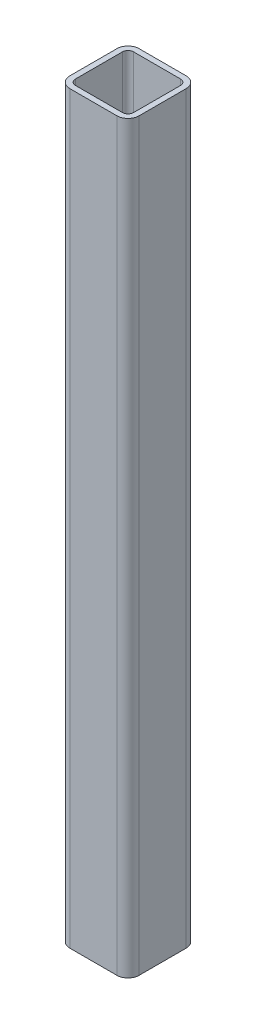
ISO-10303-21;
HEADER;
FILE_DESCRIPTION(('STEP AP214'),'2;1');
FILE_NAME('part.step','',(''),(''),'','','');
FILE_SCHEMA(('AUTOMOTIVE_DESIGN { 1 0 10303 214 1 1 1 1 }'));
ENDSEC;
DATA;
#1=APPLICATION_CONTEXT('core data for automotive mechanical design processes');
#2=APPLICATION_PROTOCOL_DEFINITION('international standard','automotive_design',2000,#1);
#3=PRODUCT_CONTEXT('',#1,'mechanical');
#4=PRODUCT('Part','Part','',(#3));
#5=PRODUCT_RELATED_PRODUCT_CATEGORY('part','',(#4));
#6=PRODUCT_DEFINITION_FORMATION('','',#4);
#7=PRODUCT_DEFINITION_CONTEXT('part definition',#1,'design');
#8=PRODUCT_DEFINITION('design','',#6,#7);
#9=PRODUCT_DEFINITION_SHAPE('','',#8);
#10=(LENGTH_UNIT() NAMED_UNIT(*) SI_UNIT(.MILLI.,.METRE.));
#11=(NAMED_UNIT(*) PLANE_ANGLE_UNIT() SI_UNIT($,.RADIAN.));
#12=(NAMED_UNIT(*) SI_UNIT($,.STERADIAN.) SOLID_ANGLE_UNIT());
#13=UNCERTAINTY_MEASURE_WITH_UNIT(LENGTH_MEASURE(1.E-05),#10,'distance_accuracy_value','');
#14=(GEOMETRIC_REPRESENTATION_CONTEXT(3) GLOBAL_UNCERTAINTY_ASSIGNED_CONTEXT((#13)) GLOBAL_UNIT_ASSIGNED_CONTEXT((#10,
#11,#12)) REPRESENTATION_CONTEXT('',''));
#15=CARTESIAN_POINT('',(0.,0.,0.));
#16=DIRECTION('',(0.,0.,1.));
#17=DIRECTION('',(1.,0.,0.));
#18=AXIS2_PLACEMENT_3D('',#15,#16,#17);
#19=CARTESIAN_POINT('',(-1206.,-1167.,89.9999999999999));
#20=DIRECTION('',(-1.,0.,0.));
#21=DIRECTION('',(0.,0.,1.));
#22=AXIS2_PLACEMENT_3D('',#19,#20,#21);
#23=CYLINDRICAL_SURFACE('',#22,2.49999999999995);
#24=CARTESIAN_POINT('',(-1200.,-1167.,89.9999999999999));
#25=DIRECTION('',(-1.,0.,0.));
#26=DIRECTION('',(0.,0.,1.));
#27=AXIS2_PLACEMENT_3D('',#24,#25,#26);
#28=CIRCLE('',#27,2.49999999999995);
#29=CARTESIAN_POINT('',(-1200.,-1167.,92.4999999999999));
#30=VERTEX_POINT('',#29);
#31=EDGE_CURVE('E22',#30,#30,#28,.T.);
#32=ORIENTED_EDGE('',*,*,#31,.T.);
#33=EDGE_LOOP('',(#32));
#34=FACE_BOUND('',#33,.T.);
#35=CARTESIAN_POINT('',(-1196.8,-1167.,89.9999999999999));
#36=DIRECTION('',(-1.,0.,0.));
#37=DIRECTION('',(0.,0.,1.));
#38=AXIS2_PLACEMENT_3D('',#35,#36,#37);
#39=CIRCLE('',#38,2.49999999999995);
#40=CARTESIAN_POINT('',(-1196.8,-1167.,92.4999999999999));
#41=VERTEX_POINT('',#40);
#42=EDGE_CURVE('E171',#41,#41,#39,.T.);
#43=ORIENTED_EDGE('',*,*,#42,.F.);
#44=EDGE_LOOP('',(#43));
#45=FACE_BOUND('',#44,.T.);
#46=ADVANCED_FACE('F19',(#34,#45),#23,.F.);
#47=CARTESIAN_POINT('',(-1206.,-1047.,89.9999999999999));
#48=DIRECTION('',(-1.,0.,0.));
#49=DIRECTION('',(0.,0.,1.));
#50=AXIS2_PLACEMENT_3D('',#47,#48,#49);
#51=CYLINDRICAL_SURFACE('',#50,2.49999999999995);
#52=CARTESIAN_POINT('',(-1200.,-1047.,89.9999999999999));
#53=DIRECTION('',(-1.,0.,0.));
#54=DIRECTION('',(0.,0.,1.));
#55=AXIS2_PLACEMENT_3D('',#52,#53,#54);
#56=CIRCLE('',#55,2.49999999999995);
#57=CARTESIAN_POINT('',(-1200.,-1047.,92.4999999999999));
#58=VERTEX_POINT('',#57);
#59=EDGE_CURVE('E175',#58,#58,#56,.T.);
#60=ORIENTED_EDGE('',*,*,#59,.T.);
#61=EDGE_LOOP('',(#60));
#62=FACE_BOUND('',#61,.T.);
#63=CARTESIAN_POINT('',(-1196.8,-1047.,89.9999999999999));
#64=DIRECTION('',(-1.,0.,0.));
#65=DIRECTION('',(0.,0.,1.));
#66=AXIS2_PLACEMENT_3D('',#63,#64,#65);
#67=CIRCLE('',#66,2.49999999999995);
#68=CARTESIAN_POINT('',(-1196.8,-1047.,92.4999999999999));
#69=VERTEX_POINT('',#68);
#70=EDGE_CURVE('E534',#69,#69,#67,.T.);
#71=ORIENTED_EDGE('',*,*,#70,.F.);
#72=EDGE_LOOP('',(#71));
#73=FACE_BOUND('',#72,.T.);
#74=ADVANCED_FACE('F509',(#62,#73),#51,.F.);
#75=CARTESIAN_POINT('',(-1206.,-927.,89.9999999999999));
#76=DIRECTION('',(-1.,0.,0.));
#77=DIRECTION('',(0.,0.,1.));
#78=AXIS2_PLACEMENT_3D('',#75,#76,#77);
#79=CYLINDRICAL_SURFACE('',#78,2.49999999999995);
#80=CARTESIAN_POINT('',(-1200.,-927.,89.9999999999999));
#81=DIRECTION('',(-1.,0.,0.));
#82=DIRECTION('',(0.,0.,1.));
#83=AXIS2_PLACEMENT_3D('',#80,#81,#82);
#84=CIRCLE('',#83,2.49999999999995);
#85=CARTESIAN_POINT('',(-1200.,-927.,92.4999999999999));
#86=VERTEX_POINT('',#85);
#87=EDGE_CURVE('E172',#86,#86,#84,.T.);
#88=ORIENTED_EDGE('',*,*,#87,.T.);
#89=EDGE_LOOP('',(#88));
#90=FACE_BOUND('',#89,.T.);
#91=CARTESIAN_POINT('',(-1196.8,-927.,89.9999999999999));
#92=DIRECTION('',(-1.,0.,0.));
#93=DIRECTION('',(0.,0.,1.));
#94=AXIS2_PLACEMENT_3D('',#91,#92,#93);
#95=CIRCLE('',#94,2.49999999999995);
#96=CARTESIAN_POINT('',(-1196.8,-927.,92.4999999999999));
#97=VERTEX_POINT('',#96);
#98=EDGE_CURVE('E157',#97,#97,#95,.T.);
#99=ORIENTED_EDGE('',*,*,#98,.F.);
#100=EDGE_LOOP('',(#99));
#101=FACE_BOUND('',#100,.T.);
#102=ADVANCED_FACE('F499',(#90,#101),#79,.F.);
#103=CARTESIAN_POINT('',(-1206.,-807.,89.9999999999999));
#104=DIRECTION('',(-1.,0.,0.));
#105=DIRECTION('',(0.,0.,1.));
#106=AXIS2_PLACEMENT_3D('',#103,#104,#105);
#107=CYLINDRICAL_SURFACE('',#106,2.49999999999995);
#108=CARTESIAN_POINT('',(-1200.,-807.,89.9999999999999));
#109=DIRECTION('',(-1.,0.,0.));
#110=DIRECTION('',(0.,0.,1.));
#111=AXIS2_PLACEMENT_3D('',#108,#109,#110);
#112=CIRCLE('',#111,2.49999999999995);
#113=CARTESIAN_POINT('',(-1200.,-807.,92.4999999999999));
#114=VERTEX_POINT('',#113);
#115=EDGE_CURVE('E166',#114,#114,#112,.T.);
#116=ORIENTED_EDGE('',*,*,#115,.T.);
#117=EDGE_LOOP('',(#116));
#118=FACE_BOUND('',#117,.T.);
#119=CARTESIAN_POINT('',(-1196.8,-807.,89.9999999999999));
#120=DIRECTION('',(-1.,0.,0.));
#121=DIRECTION('',(0.,0.,1.));
#122=AXIS2_PLACEMENT_3D('',#119,#120,#121);
#123=CIRCLE('',#122,2.49999999999995);
#124=CARTESIAN_POINT('',(-1196.8,-807.,92.4999999999999));
#125=VERTEX_POINT('',#124);
#126=EDGE_CURVE('E152',#125,#125,#123,.T.);
#127=ORIENTED_EDGE('',*,*,#126,.F.);
#128=EDGE_LOOP('',(#127));
#129=FACE_BOUND('',#128,.T.);
#130=ADVANCED_FACE('F490',(#118,#129),#107,.F.);
#131=CARTESIAN_POINT('',(-1193.6,-1220.,76.3999999999998));
#132=DIRECTION('',(0.,1.,0.));
#133=DIRECTION('',(0.,0.,1.));
#134=AXIS2_PLACEMENT_3D('',#131,#132,#133);
#135=CYLINDRICAL_SURFACE('',#134,6.39999999999996);
#136=CARTESIAN_POINT('',(-1193.6,-1200.,76.3999999999998));
#137=DIRECTION('',(0.,1.,0.));
#138=DIRECTION('',(0.,0.,1.));
#139=AXIS2_PLACEMENT_3D('',#136,#137,#138);
#140=CIRCLE('',#139,6.39999999999996);
#141=CARTESIAN_POINT('',(-1200.,-1200.,76.3999999999998));
#142=VERTEX_POINT('',#141);
#143=CARTESIAN_POINT('',(-1193.6,-1200.,69.9999999999998));
#144=VERTEX_POINT('',#143);
#145=EDGE_CURVE('E241',#142,#144,#140,.F.);
#146=ORIENTED_EDGE('',*,*,#145,.F.);
#147=DIRECTION('',(0.,1.,0.));
#148=VECTOR('',#147,1.);
#149=CARTESIAN_POINT('',(-1200.,-1220.,76.3999999999998));
#150=LINE('',#149,#148);
#151=CARTESIAN_POINT('',(-1200.,-770.,76.3999999999998));
#152=VERTEX_POINT('',#151);
#153=EDGE_CURVE('E128',#142,#152,#150,.T.);
#154=ORIENTED_EDGE('',*,*,#153,.T.);
#155=CARTESIAN_POINT('',(-1193.6,-770.,76.3999999999998));
#156=DIRECTION('',(0.,1.,0.));
#157=DIRECTION('',(0.,0.,1.));
#158=AXIS2_PLACEMENT_3D('',#155,#156,#157);
#159=CIRCLE('',#158,6.39999999999996);
#160=CARTESIAN_POINT('',(-1193.6,-770.,69.9999999999998));
#161=VERTEX_POINT('',#160);
#162=EDGE_CURVE('E214',#161,#152,#159,.T.);
#163=ORIENTED_EDGE('',*,*,#162,.F.);
#164=DIRECTION('',(0.,1.,0.));
#165=VECTOR('',#164,1.);
#166=CARTESIAN_POINT('',(-1193.6,-1220.,69.9999999999998));
#167=LINE('',#166,#165);
#168=EDGE_CURVE('E195',#161,#144,#167,.F.);
#169=ORIENTED_EDGE('',*,*,#168,.T.);
#170=EDGE_LOOP('',(#146,#154,#163,#169));
#171=FACE_BOUND('',#170,.T.);
#172=ADVANCED_FACE('F239',(#171),#135,.T.);
#173=CARTESIAN_POINT('',(-1193.6,-1220.,69.9999999999998));
#174=DIRECTION('',(0.,0.,1.));
#175=DIRECTION('',(1.,0.,0.));
#176=AXIS2_PLACEMENT_3D('',#173,#174,#175);
#177=PLANE('',#176);
#178=DIRECTION('',(1.,0.,0.));
#179=VECTOR('',#178,1.);
#180=CARTESIAN_POINT('',(-1166.4,-770.,69.9999999999998));
#181=LINE('',#180,#179);
#182=CARTESIAN_POINT('',(-1166.4,-770.,69.9999999999998));
#183=VERTEX_POINT('',#182);
#184=EDGE_CURVE('E215',#183,#161,#181,.F.);
#185=ORIENTED_EDGE('',*,*,#184,.F.);
#186=DIRECTION('',(0.,1.,0.));
#187=VECTOR('',#186,1.);
#188=CARTESIAN_POINT('',(-1166.4,-1220.,69.9999999999998));
#189=LINE('',#188,#187);
#190=CARTESIAN_POINT('',(-1166.4,-1200.,69.9999999999998));
#191=VERTEX_POINT('',#190);
#192=EDGE_CURVE('E192',#191,#183,#189,.T.);
#193=ORIENTED_EDGE('',*,*,#192,.F.);
#194=DIRECTION('',(1.,0.,0.));
#195=VECTOR('',#194,1.);
#196=CARTESIAN_POINT('',(-1193.6,-1200.,69.9999999999998));
#197=LINE('',#196,#195);
#198=EDGE_CURVE('E262',#144,#191,#197,.T.);
#199=ORIENTED_EDGE('',*,*,#198,.F.);
#200=ORIENTED_EDGE('',*,*,#168,.F.);
#201=EDGE_LOOP('',(#185,#193,#199,#200));
#202=FACE_BOUND('',#201,.T.);
#203=ADVANCED_FACE('F261',(#202),#177,.F.);
#204=CARTESIAN_POINT('',(-1166.4,-1220.,76.3999999999998));
#205=DIRECTION('',(0.,1.,0.));
#206=DIRECTION('',(0.,0.,1.));
#207=AXIS2_PLACEMENT_3D('',#204,#205,#206);
#208=CYLINDRICAL_SURFACE('',#207,6.39999999999996);
#209=CARTESIAN_POINT('',(-1166.4,-1200.,76.3999999999998));
#210=DIRECTION('',(0.,1.,0.));
#211=DIRECTION('',(0.,0.,1.));
#212=AXIS2_PLACEMENT_3D('',#209,#210,#211);
#213=CIRCLE('',#212,6.39999999999996);
#214=CARTESIAN_POINT('',(-1160.,-1200.,76.3999999999998));
#215=VERTEX_POINT('',#214);
#216=EDGE_CURVE('E257',#191,#215,#213,.F.);
#217=ORIENTED_EDGE('',*,*,#216,.F.);
#218=ORIENTED_EDGE('',*,*,#192,.T.);
#219=CARTESIAN_POINT('',(-1166.4,-770.,76.3999999999998));
#220=DIRECTION('',(0.,1.,0.));
#221=DIRECTION('',(0.,0.,1.));
#222=AXIS2_PLACEMENT_3D('',#219,#220,#221);
#223=CIRCLE('',#222,6.39999999999996);
#224=CARTESIAN_POINT('',(-1160.,-770.,76.3999999999998));
#225=VERTEX_POINT('',#224);
#226=EDGE_CURVE('E218',#225,#183,#223,.T.);
#227=ORIENTED_EDGE('',*,*,#226,.F.);
#228=DIRECTION('',(0.,1.,0.));
#229=VECTOR('',#228,1.);
#230=CARTESIAN_POINT('',(-1160.,-1220.,76.3999999999999));
#231=LINE('',#230,#229);
#232=EDGE_CURVE('E190',#225,#215,#231,.F.);
#233=ORIENTED_EDGE('',*,*,#232,.T.);
#234=EDGE_LOOP('',(#217,#218,#227,#233));
#235=FACE_BOUND('',#234,.T.);
#236=ADVANCED_FACE('F254',(#235),#208,.T.);
#237=CARTESIAN_POINT('',(-1160.,-1220.,103.6));
#238=DIRECTION('',(-1.,0.,0.));
#239=DIRECTION('',(0.,0.,1.));
#240=AXIS2_PLACEMENT_3D('',#237,#238,#239);
#241=PLANE('',#240);
#242=DIRECTION('',(0.,0.,1.));
#243=VECTOR('',#242,1.);
#244=CARTESIAN_POINT('',(-1160.,-770.,-880.));
#245=LINE('',#244,#243);
#246=CARTESIAN_POINT('',(-1160.,-770.,103.6));
#247=VERTEX_POINT('',#246);
#248=EDGE_CURVE('E219',#247,#225,#245,.F.);
#249=ORIENTED_EDGE('',*,*,#248,.F.);
#250=DIRECTION('',(0.,1.,0.));
#251=VECTOR('',#250,1.);
#252=CARTESIAN_POINT('',(-1160.,-1220.,103.6));
#253=LINE('',#252,#251);
#254=CARTESIAN_POINT('',(-1160.,-1200.,103.6));
#255=VERTEX_POINT('',#254);
#256=EDGE_CURVE('E187',#255,#247,#253,.T.);
#257=ORIENTED_EDGE('',*,*,#256,.F.);
#258=DIRECTION('',(0.,0.,-1.));
#259=VECTOR('',#258,1.);
#260=CARTESIAN_POINT('',(-1160.,-1200.,-880.));
#261=LINE('',#260,#259);
#262=EDGE_CURVE('E326',#215,#255,#261,.F.);
#263=ORIENTED_EDGE('',*,*,#262,.F.);
#264=ORIENTED_EDGE('',*,*,#232,.F.);
#265=EDGE_LOOP('',(#249,#257,#263,#264));
#266=FACE_BOUND('',#265,.T.);
#267=ADVANCED_FACE('F348',(#266),#241,.F.);
#268=CARTESIAN_POINT('',(-1166.4,-1220.,103.6));
#269=DIRECTION('',(0.,1.,0.));
#270=DIRECTION('',(0.,0.,1.));
#271=AXIS2_PLACEMENT_3D('',#268,#269,#270);
#272=CYLINDRICAL_SURFACE('',#271,6.39999999999996);
#273=CARTESIAN_POINT('',(-1166.4,-1200.,103.6));
#274=DIRECTION('',(0.,1.,0.));
#275=DIRECTION('',(0.,0.,1.));
#276=AXIS2_PLACEMENT_3D('',#273,#274,#275);
#277=CIRCLE('',#276,6.39999999999996);
#278=CARTESIAN_POINT('',(-1166.4,-1200.,110.));
#279=VERTEX_POINT('',#278);
#280=EDGE_CURVE('E329',#255,#279,#277,.F.);
#281=ORIENTED_EDGE('',*,*,#280,.F.);
#282=ORIENTED_EDGE('',*,*,#256,.T.);
#283=CARTESIAN_POINT('',(-1166.4,-770.,103.6));
#284=DIRECTION('',(0.,1.,0.));
#285=DIRECTION('',(0.,0.,1.));
#286=AXIS2_PLACEMENT_3D('',#283,#284,#285);
#287=CIRCLE('',#286,6.39999999999996);
#288=CARTESIAN_POINT('',(-1166.4,-770.,110.));
#289=VERTEX_POINT('',#288);
#290=EDGE_CURVE('E137',#289,#247,#287,.T.);
#291=ORIENTED_EDGE('',*,*,#290,.F.);
#292=DIRECTION('',(0.,1.,0.));
#293=VECTOR('',#292,1.);
#294=CARTESIAN_POINT('',(-1166.4,-1220.,110.));
#295=LINE('',#294,#293);
#296=EDGE_CURVE('E129',#289,#279,#295,.F.);
#297=ORIENTED_EDGE('',*,*,#296,.T.);
#298=EDGE_LOOP('',(#281,#282,#291,#297));
#299=FACE_BOUND('',#298,.T.);
#300=ADVANCED_FACE('F346',(#299),#272,.T.);
#301=CARTESIAN_POINT('',(-1166.4,-1220.,110.));
#302=DIRECTION('',(0.,0.,-1.));
#303=DIRECTION('',(-1.,0.,0.));
#304=AXIS2_PLACEMENT_3D('',#301,#302,#303);
#305=PLANE('',#304);
#306=DIRECTION('',(1.,0.,0.));
#307=VECTOR('',#306,1.);
#308=CARTESIAN_POINT('',(-1166.4,-770.,110.));
#309=LINE('',#308,#307);
#310=CARTESIAN_POINT('',(-1193.6,-770.,110.));
#311=VERTEX_POINT('',#310);
#312=EDGE_CURVE('E132',#311,#289,#309,.T.);
#313=ORIENTED_EDGE('',*,*,#312,.F.);
#314=DIRECTION('',(0.,1.,0.));
#315=VECTOR('',#314,1.);
#316=CARTESIAN_POINT('',(-1193.6,-1220.,110.));
#317=LINE('',#316,#315);
#318=CARTESIAN_POINT('',(-1193.6,-1200.,110.));
#319=VERTEX_POINT('',#318);
#320=EDGE_CURVE('E120',#319,#311,#317,.T.);
#321=ORIENTED_EDGE('',*,*,#320,.F.);
#322=DIRECTION('',(1.,0.,0.));
#323=VECTOR('',#322,1.);
#324=CARTESIAN_POINT('',(-1193.6,-1200.,110.));
#325=LINE('',#324,#323);
#326=EDGE_CURVE('E330',#279,#319,#325,.F.);
#327=ORIENTED_EDGE('',*,*,#326,.F.);
#328=ORIENTED_EDGE('',*,*,#296,.F.);
#329=EDGE_LOOP('',(#313,#321,#327,#328));
#330=FACE_BOUND('',#329,.T.);
#331=ADVANCED_FACE('F133',(#330),#305,.F.);
#332=CARTESIAN_POINT('',(-1193.6,-1220.,103.6));
#333=DIRECTION('',(0.,1.,0.));
#334=DIRECTION('',(0.,0.,1.));
#335=AXIS2_PLACEMENT_3D('',#332,#333,#334);
#336=CYLINDRICAL_SURFACE('',#335,6.40000000000002);
#337=CARTESIAN_POINT('',(-1193.6,-1200.,103.6));
#338=DIRECTION('',(0.,1.,0.));
#339=DIRECTION('',(0.,0.,1.));
#340=AXIS2_PLACEMENT_3D('',#337,#338,#339);
#341=CIRCLE('',#340,6.40000000000002);
#342=CARTESIAN_POINT('',(-1200.,-1200.,103.6));
#343=VERTEX_POINT('',#342);
#344=EDGE_CURVE('E124',#319,#343,#341,.F.);
#345=ORIENTED_EDGE('',*,*,#344,.F.);
#346=ORIENTED_EDGE('',*,*,#320,.T.);
#347=CARTESIAN_POINT('',(-1193.6,-770.,103.6));
#348=DIRECTION('',(0.,1.,0.));
#349=DIRECTION('',(0.,0.,1.));
#350=AXIS2_PLACEMENT_3D('',#347,#348,#349);
#351=CIRCLE('',#350,6.40000000000002);
#352=CARTESIAN_POINT('',(-1200.,-770.,103.6));
#353=VERTEX_POINT('',#352);
#354=EDGE_CURVE('E117',#353,#311,#351,.T.);
#355=ORIENTED_EDGE('',*,*,#354,.F.);
#356=DIRECTION('',(0.,1.,0.));
#357=VECTOR('',#356,1.);
#358=CARTESIAN_POINT('',(-1200.,-1220.,103.6));
#359=LINE('',#358,#357);
#360=EDGE_CURVE('E233',#353,#343,#359,.F.);
#361=ORIENTED_EDGE('',*,*,#360,.T.);
#362=EDGE_LOOP('',(#345,#346,#355,#361));
#363=FACE_BOUND('',#362,.T.);
#364=ADVANCED_FACE('F122',(#363),#336,.T.);
#365=CARTESIAN_POINT('',(-1200.,-1220.,76.3999999999998));
#366=DIRECTION('',(1.,0.,0.));
#367=DIRECTION('',(0.,0.,-1.));
#368=AXIS2_PLACEMENT_3D('',#365,#366,#367);
#369=PLANE('',#368);
#370=ORIENTED_EDGE('',*,*,#115,.F.);
#371=EDGE_LOOP('',(#370));
#372=FACE_BOUND('',#371,.T.);
#373=ORIENTED_EDGE('',*,*,#87,.F.);
#374=EDGE_LOOP('',(#373));
#375=FACE_BOUND('',#374,.T.);
#376=ORIENTED_EDGE('',*,*,#59,.F.);
#377=EDGE_LOOP('',(#376));
#378=FACE_BOUND('',#377,.T.);
#379=ORIENTED_EDGE('',*,*,#31,.F.);
#380=EDGE_LOOP('',(#379));
#381=FACE_BOUND('',#380,.T.);
#382=DIRECTION('',(0.,0.,1.));
#383=VECTOR('',#382,1.);
#384=CARTESIAN_POINT('',(-1200.,-770.,-880.));
#385=LINE('',#384,#383);
#386=EDGE_CURVE('E143',#152,#353,#385,.T.);
#387=ORIENTED_EDGE('',*,*,#386,.F.);
#388=ORIENTED_EDGE('',*,*,#153,.F.);
#389=DIRECTION('',(0.,0.,-1.));
#390=VECTOR('',#389,1.);
#391=CARTESIAN_POINT('',(-1200.,-1200.,-880.));
#392=LINE('',#391,#390);
#393=EDGE_CURVE('E266',#343,#142,#392,.T.);
#394=ORIENTED_EDGE('',*,*,#393,.F.);
#395=ORIENTED_EDGE('',*,*,#360,.F.);
#396=EDGE_LOOP('',(#387,#388,#394,#395));
#397=FACE_BOUND('',#396,.T.);
#398=ADVANCED_FACE('F244',(#372,#375,#378,#381,#397),#369,.F.);
#399=CARTESIAN_POINT('',(-1196.8,-1220.,76.3999999999998));
#400=DIRECTION('',(1.,0.,0.));
#401=DIRECTION('',(0.,0.,-1.));
#402=AXIS2_PLACEMENT_3D('',#399,#400,#401);
#403=PLANE('',#402);
#404=ORIENTED_EDGE('',*,*,#126,.T.);
#405=EDGE_LOOP('',(#404));
#406=FACE_BOUND('',#405,.T.);
#407=ORIENTED_EDGE('',*,*,#98,.T.);
#408=EDGE_LOOP('',(#407));
#409=FACE_BOUND('',#408,.T.);
#410=ORIENTED_EDGE('',*,*,#70,.T.);
#411=EDGE_LOOP('',(#410));
#412=FACE_BOUND('',#411,.T.);
#413=ORIENTED_EDGE('',*,*,#42,.T.);
#414=EDGE_LOOP('',(#413));
#415=FACE_BOUND('',#414,.T.);
#416=DIRECTION('',(0.,1.,0.));
#417=VECTOR('',#416,1.);
#418=CARTESIAN_POINT('',(-1196.8,-1220.,103.6));
#419=LINE('',#418,#417);
#420=CARTESIAN_POINT('',(-1196.8,-770.,103.6));
#421=VERTEX_POINT('',#420);
#422=CARTESIAN_POINT('',(-1196.8,-1200.,103.6));
#423=VERTEX_POINT('',#422);
#424=EDGE_CURVE('E156',#421,#423,#419,.F.);
#425=ORIENTED_EDGE('',*,*,#424,.T.);
#426=DIRECTION('',(0.,0.,-1.));
#427=VECTOR('',#426,1.);
#428=CARTESIAN_POINT('',(-1196.8,-1200.,-880.));
#429=LINE('',#428,#427);
#430=CARTESIAN_POINT('',(-1196.8,-1200.,76.3999999999998));
#431=VERTEX_POINT('',#430);
#432=EDGE_CURVE('E333',#431,#423,#429,.F.);
#433=ORIENTED_EDGE('',*,*,#432,.F.);
#434=DIRECTION('',(0.,1.,0.));
#435=VECTOR('',#434,1.);
#436=CARTESIAN_POINT('',(-1196.8,-1220.,76.3999999999998));
#437=LINE('',#436,#435);
#438=CARTESIAN_POINT('',(-1196.8,-770.,76.3999999999998));
#439=VERTEX_POINT('',#438);
#440=EDGE_CURVE('E231',#431,#439,#437,.T.);
#441=ORIENTED_EDGE('',*,*,#440,.T.);
#442=DIRECTION('',(0.,0.,1.));
#443=VECTOR('',#442,1.);
#444=CARTESIAN_POINT('',(-1196.8,-770.,-880.));
#445=LINE('',#444,#443);
#446=EDGE_CURVE('E206',#421,#439,#445,.F.);
#447=ORIENTED_EDGE('',*,*,#446,.F.);
#448=EDGE_LOOP('',(#425,#433,#441,#447));
#449=FACE_BOUND('',#448,.T.);
#450=ADVANCED_FACE('F318',(#406,#409,#412,#415,#449),#403,.T.);
#451=CARTESIAN_POINT('',(-1193.6,-1220.,103.6));
#452=DIRECTION('',(0.,1.,0.));
#453=DIRECTION('',(0.,0.,1.));
#454=AXIS2_PLACEMENT_3D('',#451,#452,#453);
#455=CYLINDRICAL_SURFACE('',#454,3.19999999999998);
#456=ORIENTED_EDGE('',*,*,#424,.F.);
#457=CARTESIAN_POINT('',(-1193.6,-770.,103.6));
#458=DIRECTION('',(0.,1.,0.));
#459=DIRECTION('',(0.,0.,1.));
#460=AXIS2_PLACEMENT_3D('',#457,#458,#459);
#461=CIRCLE('',#460,3.19999999999998);
#462=CARTESIAN_POINT('',(-1193.6,-770.,106.8));
#463=VERTEX_POINT('',#462);
#464=EDGE_CURVE('E209',#463,#421,#461,.F.);
#465=ORIENTED_EDGE('',*,*,#464,.F.);
#466=DIRECTION('',(0.,1.,0.));
#467=VECTOR('',#466,1.);
#468=CARTESIAN_POINT('',(-1193.6,-1220.,106.8));
#469=LINE('',#468,#467);
#470=CARTESIAN_POINT('',(-1193.6,-1200.,106.8));
#471=VERTEX_POINT('',#470);
#472=EDGE_CURVE('E227',#471,#463,#469,.T.);
#473=ORIENTED_EDGE('',*,*,#472,.F.);
#474=CARTESIAN_POINT('',(-1193.6,-1200.,103.6));
#475=DIRECTION('',(0.,1.,0.));
#476=DIRECTION('',(0.,0.,1.));
#477=AXIS2_PLACEMENT_3D('',#474,#475,#476);
#478=CIRCLE('',#477,3.19999999999998);
#479=EDGE_CURVE('E314',#423,#471,#478,.T.);
#480=ORIENTED_EDGE('',*,*,#479,.F.);
#481=EDGE_LOOP('',(#456,#465,#473,#480));
#482=FACE_BOUND('',#481,.T.);
#483=ADVANCED_FACE('F312',(#482),#455,.F.);
#484=CARTESIAN_POINT('',(-1166.4,-1220.,106.8));
#485=DIRECTION('',(0.,0.,-1.));
#486=DIRECTION('',(-1.,0.,0.));
#487=AXIS2_PLACEMENT_3D('',#484,#485,#486);
#488=PLANE('',#487);
#489=DIRECTION('',(0.,1.,0.));
#490=VECTOR('',#489,1.);
#491=CARTESIAN_POINT('',(-1166.4,-1220.,106.8));
#492=LINE('',#491,#490);
#493=CARTESIAN_POINT('',(-1166.4,-770.,106.8));
#494=VERTEX_POINT('',#493);
#495=CARTESIAN_POINT('',(-1166.4,-1200.,106.8));
#496=VERTEX_POINT('',#495);
#497=EDGE_CURVE('E224',#494,#496,#492,.F.);
#498=ORIENTED_EDGE('',*,*,#497,.T.);
#499=DIRECTION('',(1.,0.,0.));
#500=VECTOR('',#499,1.);
#501=CARTESIAN_POINT('',(-1193.6,-1200.,106.8));
#502=LINE('',#501,#500);
#503=EDGE_CURVE('E308',#471,#496,#502,.T.);
#504=ORIENTED_EDGE('',*,*,#503,.F.);
#505=ORIENTED_EDGE('',*,*,#472,.T.);
#506=DIRECTION('',(1.,0.,0.));
#507=VECTOR('',#506,1.);
#508=CARTESIAN_POINT('',(-1166.4,-770.,106.8));
#509=LINE('',#508,#507);
#510=EDGE_CURVE('E210',#494,#463,#509,.F.);
#511=ORIENTED_EDGE('',*,*,#510,.F.);
#512=EDGE_LOOP('',(#498,#504,#505,#511));
#513=FACE_BOUND('',#512,.T.);
#514=ADVANCED_FACE('F303',(#513),#488,.T.);
#515=CARTESIAN_POINT('',(-1166.4,-1220.,103.6));
#516=DIRECTION('',(0.,1.,0.));
#517=DIRECTION('',(0.,0.,1.));
#518=AXIS2_PLACEMENT_3D('',#515,#516,#517);
#519=CYLINDRICAL_SURFACE('',#518,3.19999999999993);
#520=ORIENTED_EDGE('',*,*,#497,.F.);
#521=CARTESIAN_POINT('',(-1166.4,-770.,103.6));
#522=DIRECTION('',(0.,1.,0.));
#523=DIRECTION('',(0.,0.,1.));
#524=AXIS2_PLACEMENT_3D('',#521,#522,#523);
#525=CIRCLE('',#524,3.19999999999993);
#526=CARTESIAN_POINT('',(-1163.2,-770.,103.6));
#527=VERTEX_POINT('',#526);
#528=EDGE_CURVE('E202',#527,#494,#525,.F.);
#529=ORIENTED_EDGE('',*,*,#528,.F.);
#530=DIRECTION('',(0.,1.,0.));
#531=VECTOR('',#530,1.);
#532=CARTESIAN_POINT('',(-1163.2,-1220.,103.6));
#533=LINE('',#532,#531);
#534=CARTESIAN_POINT('',(-1163.2,-1200.,103.6));
#535=VERTEX_POINT('',#534);
#536=EDGE_CURVE('E147',#535,#527,#533,.T.);
#537=ORIENTED_EDGE('',*,*,#536,.F.);
#538=CARTESIAN_POINT('',(-1166.4,-1200.,103.6));
#539=DIRECTION('',(0.,1.,0.));
#540=DIRECTION('',(0.,0.,1.));
#541=AXIS2_PLACEMENT_3D('',#538,#539,#540);
#542=CIRCLE('',#541,3.19999999999993);
#543=EDGE_CURVE('E336',#496,#535,#542,.T.);
#544=ORIENTED_EDGE('',*,*,#543,.F.);
#545=EDGE_LOOP('',(#520,#529,#537,#544));
#546=FACE_BOUND('',#545,.T.);
#547=ADVANCED_FACE('F299',(#546),#519,.F.);
#548=CARTESIAN_POINT('',(-1163.2,-1220.,103.6));
#549=DIRECTION('',(-1.,0.,0.));
#550=DIRECTION('',(0.,0.,1.));
#551=AXIS2_PLACEMENT_3D('',#548,#549,#550);
#552=PLANE('',#551);
#553=DIRECTION('',(0.,1.,0.));
#554=VECTOR('',#553,1.);
#555=CARTESIAN_POINT('',(-1163.2,-1220.,76.3999999999998));
#556=LINE('',#555,#554);
#557=CARTESIAN_POINT('',(-1163.2,-770.,76.3999999999998));
#558=VERTEX_POINT('',#557);
#559=CARTESIAN_POINT('',(-1163.2,-1200.,76.3999999999998));
#560=VERTEX_POINT('',#559);
#561=EDGE_CURVE('E144',#558,#560,#556,.F.);
#562=ORIENTED_EDGE('',*,*,#561,.T.);
#563=DIRECTION('',(0.,0.,-1.));
#564=VECTOR('',#563,1.);
#565=CARTESIAN_POINT('',(-1163.2,-1200.,-880.));
#566=LINE('',#565,#564);
#567=EDGE_CURVE('E294',#535,#560,#566,.T.);
#568=ORIENTED_EDGE('',*,*,#567,.F.);
#569=ORIENTED_EDGE('',*,*,#536,.T.);
#570=DIRECTION('',(0.,0.,1.));
#571=VECTOR('',#570,1.);
#572=CARTESIAN_POINT('',(-1163.2,-770.,-880.));
#573=LINE('',#572,#571);
#574=EDGE_CURVE('E197',#558,#527,#573,.T.);
#575=ORIENTED_EDGE('',*,*,#574,.F.);
#576=EDGE_LOOP('',(#562,#568,#569,#575));
#577=FACE_BOUND('',#576,.T.);
#578=ADVANCED_FACE('F290',(#577),#552,.T.);
#579=CARTESIAN_POINT('',(-1166.4,-1220.,76.3999999999998));
#580=DIRECTION('',(0.,1.,0.));
#581=DIRECTION('',(0.,0.,1.));
#582=AXIS2_PLACEMENT_3D('',#579,#580,#581);
#583=CYLINDRICAL_SURFACE('',#582,3.19999999999993);
#584=ORIENTED_EDGE('',*,*,#561,.F.);
#585=CARTESIAN_POINT('',(-1166.4,-770.,76.3999999999998));
#586=DIRECTION('',(0.,1.,0.));
#587=DIRECTION('',(0.,0.,1.));
#588=AXIS2_PLACEMENT_3D('',#585,#586,#587);
#589=CIRCLE('',#588,3.19999999999993);
#590=CARTESIAN_POINT('',(-1166.4,-770.,73.1999999999998));
#591=VERTEX_POINT('',#590);
#592=EDGE_CURVE('E203',#591,#558,#589,.F.);
#593=ORIENTED_EDGE('',*,*,#592,.F.);
#594=DIRECTION('',(0.,1.,0.));
#595=VECTOR('',#594,1.);
#596=CARTESIAN_POINT('',(-1166.4,-1220.,73.1999999999998));
#597=LINE('',#596,#595);
#598=CARTESIAN_POINT('',(-1166.4,-1200.,73.1999999999998));
#599=VERTEX_POINT('',#598);
#600=EDGE_CURVE('E283',#599,#591,#597,.T.);
#601=ORIENTED_EDGE('',*,*,#600,.F.);
#602=CARTESIAN_POINT('',(-1166.4,-1200.,76.3999999999998));
#603=DIRECTION('',(0.,1.,0.));
#604=DIRECTION('',(0.,0.,1.));
#605=AXIS2_PLACEMENT_3D('',#602,#603,#604);
#606=CIRCLE('',#605,3.19999999999993);
#607=EDGE_CURVE('E286',#560,#599,#606,.T.);
#608=ORIENTED_EDGE('',*,*,#607,.F.);
#609=EDGE_LOOP('',(#584,#593,#601,#608));
#610=FACE_BOUND('',#609,.T.);
#611=ADVANCED_FACE('F281',(#610),#583,.F.);
#612=CARTESIAN_POINT('',(-1166.4,-770.,-880.));
#613=DIRECTION('',(0.,1.,0.));
#614=DIRECTION('',(0.,0.,1.));
#615=AXIS2_PLACEMENT_3D('',#612,#613,#614);
#616=PLANE('',#615);
#617=ORIENTED_EDGE('',*,*,#574,.T.);
#618=ORIENTED_EDGE('',*,*,#528,.T.);
#619=ORIENTED_EDGE('',*,*,#510,.T.);
#620=ORIENTED_EDGE('',*,*,#464,.T.);
#621=ORIENTED_EDGE('',*,*,#446,.T.);
#622=CARTESIAN_POINT('',(-1193.6,-770.,76.3999999999998));
#623=DIRECTION('',(0.,1.,0.));
#624=DIRECTION('',(0.,0.,1.));
#625=AXIS2_PLACEMENT_3D('',#622,#623,#624);
#626=CIRCLE('',#625,3.19999999999993);
#627=CARTESIAN_POINT('',(-1193.6,-770.,73.1999999999998));
#628=VERTEX_POINT('',#627);
#629=EDGE_CURVE('E232',#439,#628,#626,.F.);
#630=ORIENTED_EDGE('',*,*,#629,.T.);
#631=DIRECTION('',(1.,0.,0.));
#632=VECTOR('',#631,1.);
#633=CARTESIAN_POINT('',(-1193.6,-770.,73.1999999999998));
#634=LINE('',#633,#632);
#635=EDGE_CURVE('E204',#591,#628,#634,.F.);
#636=ORIENTED_EDGE('',*,*,#635,.F.);
#637=ORIENTED_EDGE('',*,*,#592,.T.);
#638=EDGE_LOOP('',(#617,#618,#619,#620,#621,#630,#636,#637));
#639=FACE_BOUND('',#638,.T.);
#640=ORIENTED_EDGE('',*,*,#162,.T.);
#641=ORIENTED_EDGE('',*,*,#386,.T.);
#642=ORIENTED_EDGE('',*,*,#354,.T.);
#643=ORIENTED_EDGE('',*,*,#312,.T.);
#644=ORIENTED_EDGE('',*,*,#290,.T.);
#645=ORIENTED_EDGE('',*,*,#248,.T.);
#646=ORIENTED_EDGE('',*,*,#226,.T.);
#647=ORIENTED_EDGE('',*,*,#184,.T.);
#648=EDGE_LOOP('',(#640,#641,#642,#643,#644,#645,#646,#647));
#649=FACE_BOUND('',#648,.T.);
#650=ADVANCED_FACE('F141',(#639,#649),#616,.T.);
#651=CARTESIAN_POINT('',(-1193.6,-1220.,76.3999999999998));
#652=DIRECTION('',(0.,1.,0.));
#653=DIRECTION('',(0.,0.,1.));
#654=AXIS2_PLACEMENT_3D('',#651,#652,#653);
#655=CYLINDRICAL_SURFACE('',#654,3.19999999999993);
#656=DIRECTION('',(0.,1.,0.));
#657=VECTOR('',#656,1.);
#658=CARTESIAN_POINT('',(-1193.6,-1220.,73.1999999999998));
#659=LINE('',#658,#657);
#660=CARTESIAN_POINT('',(-1193.6,-1200.,73.1999999999998));
#661=VERTEX_POINT('',#660);
#662=EDGE_CURVE('E29',#628,#661,#659,.F.);
#663=ORIENTED_EDGE('',*,*,#662,.F.);
#664=ORIENTED_EDGE('',*,*,#629,.F.);
#665=ORIENTED_EDGE('',*,*,#440,.F.);
#666=CARTESIAN_POINT('',(-1193.6,-1200.,76.3999999999998));
#667=DIRECTION('',(0.,1.,0.));
#668=DIRECTION('',(0.,0.,1.));
#669=AXIS2_PLACEMENT_3D('',#666,#667,#668);
#670=CIRCLE('',#669,3.19999999999993);
#671=EDGE_CURVE('E38',#661,#431,#670,.T.);
#672=ORIENTED_EDGE('',*,*,#671,.F.);
#673=EDGE_LOOP('',(#663,#664,#665,#672));
#674=FACE_BOUND('',#673,.T.);
#675=ADVANCED_FACE('F320',(#674),#655,.F.);
#676=CARTESIAN_POINT('',(-1193.6,-1200.,-880.));
#677=DIRECTION('',(0.,-1.,0.));
#678=DIRECTION('',(0.,0.,-1.));
#679=AXIS2_PLACEMENT_3D('',#676,#677,#678);
#680=PLANE('',#679);
#681=ORIENTED_EDGE('',*,*,#607,.T.);
#682=DIRECTION('',(1.,0.,0.));
#683=VECTOR('',#682,1.);
#684=CARTESIAN_POINT('',(-1193.6,-1200.,73.1999999999998));
#685=LINE('',#684,#683);
#686=EDGE_CURVE('E12',#661,#599,#685,.T.);
#687=ORIENTED_EDGE('',*,*,#686,.F.);
#688=ORIENTED_EDGE('',*,*,#671,.T.);
#689=ORIENTED_EDGE('',*,*,#432,.T.);
#690=ORIENTED_EDGE('',*,*,#479,.T.);
#691=ORIENTED_EDGE('',*,*,#503,.T.);
#692=ORIENTED_EDGE('',*,*,#543,.T.);
#693=ORIENTED_EDGE('',*,*,#567,.T.);
#694=EDGE_LOOP('',(#681,#687,#688,#689,#690,#691,#692,#693));
#695=FACE_BOUND('',#694,.T.);
#696=ORIENTED_EDGE('',*,*,#344,.T.);
#697=ORIENTED_EDGE('',*,*,#393,.T.);
#698=ORIENTED_EDGE('',*,*,#145,.T.);
#699=ORIENTED_EDGE('',*,*,#198,.T.);
#700=ORIENTED_EDGE('',*,*,#216,.T.);
#701=ORIENTED_EDGE('',*,*,#262,.T.);
#702=ORIENTED_EDGE('',*,*,#280,.T.);
#703=ORIENTED_EDGE('',*,*,#326,.T.);
#704=EDGE_LOOP('',(#696,#697,#698,#699,#700,#701,#702,#703));
#705=FACE_BOUND('',#704,.T.);
#706=ADVANCED_FACE('F265',(#695,#705),#680,.T.);
#707=CARTESIAN_POINT('',(-1193.6,-1220.,73.1999999999998));
#708=DIRECTION('',(0.,0.,1.));
#709=DIRECTION('',(1.,0.,0.));
#710=AXIS2_PLACEMENT_3D('',#707,#708,#709);
#711=PLANE('',#710);
#712=ORIENTED_EDGE('',*,*,#662,.T.);
#713=ORIENTED_EDGE('',*,*,#686,.T.);
#714=ORIENTED_EDGE('',*,*,#600,.T.);
#715=ORIENTED_EDGE('',*,*,#635,.T.);
#716=EDGE_LOOP('',(#712,#713,#714,#715));
#717=FACE_BOUND('',#716,.T.);
#718=ADVANCED_FACE('F324',(#717),#711,.T.);
#719=CLOSED_SHELL('',(#46,#74,#102,#130,#172,#203,#236,#267,#300,#331,#364,#398,#450,#483,#514,
#547,#578,#611,#650,#675,#706,#718));
#720=MANIFOLD_SOLID_BREP('B1',#719);
#721=ADVANCED_BREP_SHAPE_REPRESENTATION('',(#18,#720),#14);
#722=SHAPE_DEFINITION_REPRESENTATION(#9,#721);
ENDSEC;
END-ISO-10303-21;
